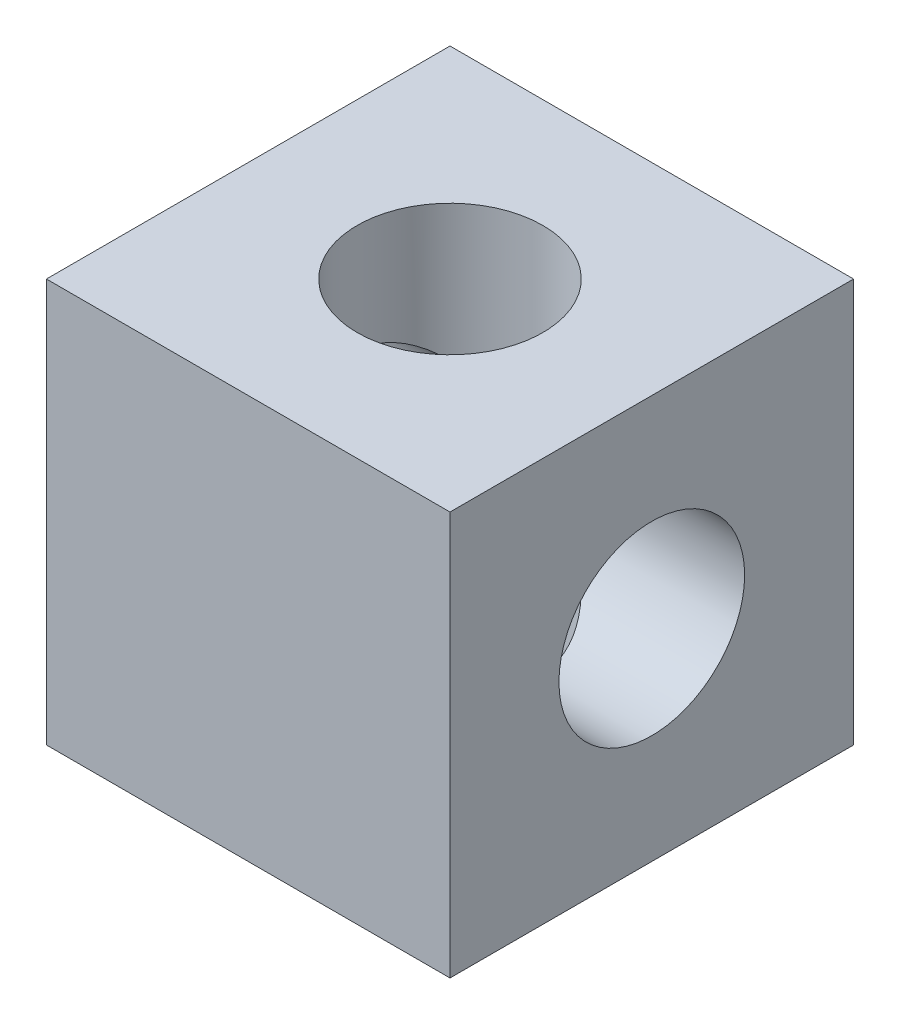
ISO-10303-21;
HEADER;
FILE_DESCRIPTION(('STEP AP214'),'2;1');
FILE_NAME('part.step','',(''),(''),'','','');
FILE_SCHEMA(('AUTOMOTIVE_DESIGN { 1 0 10303 214 1 1 1 1 }'));
ENDSEC;
DATA;
#1=APPLICATION_CONTEXT('core data for automotive mechanical design processes');
#2=APPLICATION_PROTOCOL_DEFINITION('international standard','automotive_design',2000,#1);
#3=PRODUCT_CONTEXT('',#1,'mechanical');
#4=PRODUCT('Part','Part','',(#3));
#5=PRODUCT_RELATED_PRODUCT_CATEGORY('part','',(#4));
#6=PRODUCT_DEFINITION_FORMATION('','',#4);
#7=PRODUCT_DEFINITION_CONTEXT('part definition',#1,'design');
#8=PRODUCT_DEFINITION('design','',#6,#7);
#9=PRODUCT_DEFINITION_SHAPE('','',#8);
#10=(LENGTH_UNIT() NAMED_UNIT(*) SI_UNIT(.MILLI.,.METRE.));
#11=(NAMED_UNIT(*) PLANE_ANGLE_UNIT() SI_UNIT($,.RADIAN.));
#12=(NAMED_UNIT(*) SI_UNIT($,.STERADIAN.) SOLID_ANGLE_UNIT());
#13=UNCERTAINTY_MEASURE_WITH_UNIT(LENGTH_MEASURE(1.E-05),#10,'distance_accuracy_value','');
#14=(GEOMETRIC_REPRESENTATION_CONTEXT(3) GLOBAL_UNCERTAINTY_ASSIGNED_CONTEXT((#13)) GLOBAL_UNIT_ASSIGNED_CONTEXT((#10,
#11,#12)) REPRESENTATION_CONTEXT('',''));
#15=CARTESIAN_POINT('',(0.,0.,0.));
#16=DIRECTION('',(0.,0.,1.));
#17=DIRECTION('',(1.,0.,0.));
#18=AXIS2_PLACEMENT_3D('',#15,#16,#17);
#19=CARTESIAN_POINT('',(-2.53896029471961,-13.5951862464183,10.16));
#20=DIRECTION('',(0.,1.,0.));
#21=DIRECTION('',(0.,0.,1.));
#22=AXIS2_PLACEMENT_3D('',#19,#20,#21);
#23=CYLINDRICAL_SURFACE('',#22,4.675);
#24=CARTESIAN_POINT('',(-2.53896029471961,6.72481375358166,10.16));
#25=DIRECTION('',(0.,1.,0.));
#26=DIRECTION('',(0.,0.,1.));
#27=AXIS2_PLACEMENT_3D('',#24,#25,#26);
#28=CIRCLE('',#27,4.675);
#29=CARTESIAN_POINT('',(-2.53896029471961,6.72481375358166,14.835));
#30=VERTEX_POINT('',#29);
#31=EDGE_CURVE('E153',#30,#30,#28,.T.);
#32=ORIENTED_EDGE('',*,*,#31,.T.);
#33=EDGE_LOOP('',(#32));
#34=FACE_BOUND('',#33,.T.);
#35=CARTESIAN_POINT('',(-2.53896029471961,-3.43518624641834,10.16));
#36=DIRECTION('',(0.707106781186547,0.707106781186547,0.));
#37=DIRECTION('',(-0.707106781186547,0.707106781186547,0.));
#38=AXIS2_PLACEMENT_3D('',#35,#36,#37);
#39=ELLIPSE('',#38,6.61144840409422,4.675);
#40=CARTESIAN_POINT('',(-2.53896029471961,-3.43518624641834,14.835));
#41=VERTEX_POINT('',#40);
#42=CARTESIAN_POINT('',(-2.53896029471961,-3.43518624641834,5.485));
#43=VERTEX_POINT('',#42);
#44=EDGE_CURVE('E59',#41,#43,#39,.F.);
#45=ORIENTED_EDGE('',*,*,#44,.T.);
#46=CARTESIAN_POINT('',(-2.53896029471961,-3.43518624641834,10.16));
#47=DIRECTION('',(-0.707106781186547,0.707106781186547,0.));
#48=DIRECTION('',(0.707106781186547,0.707106781186547,0.));
#49=AXIS2_PLACEMENT_3D('',#46,#47,#48);
#50=ELLIPSE('',#49,6.61144840409422,4.675);
#51=EDGE_CURVE('E11',#43,#41,#50,.F.);
#52=ORIENTED_EDGE('',*,*,#51,.T.);
#53=EDGE_LOOP('',(#45,#52));
#54=FACE_BOUND('',#53,.T.);
#55=ADVANCED_FACE('F45',(#34,#54),#23,.F.);
#56=CARTESIAN_POINT('',(-12.6989602947196,6.72481375358166,20.32));
#57=DIRECTION('',(1.,0.,0.));
#58=DIRECTION('',(0.,0.,-1.));
#59=AXIS2_PLACEMENT_3D('',#56,#57,#58);
#60=PLANE('',#59);
#61=CARTESIAN_POINT('',(-12.6989602947196,-3.43518624641834,10.16));
#62=DIRECTION('',(-1.,0.,0.));
#63=DIRECTION('',(0.,0.,1.));
#64=AXIS2_PLACEMENT_3D('',#61,#62,#63);
#65=CIRCLE('',#64,4.675);
#66=CARTESIAN_POINT('',(-12.6989602947196,-3.43518624641834,14.835));
#67=VERTEX_POINT('',#66);
#68=EDGE_CURVE('E161',#67,#67,#65,.T.);
#69=ORIENTED_EDGE('',*,*,#68,.F.);
#70=EDGE_LOOP('',(#69));
#71=FACE_BOUND('',#70,.T.);
#72=DIRECTION('',(0.,-1.,0.));
#73=VECTOR('',#72,1.);
#74=CARTESIAN_POINT('',(-12.6989602947196,6.72481375358166,0.));
#75=LINE('',#74,#73);
#76=CARTESIAN_POINT('',(-12.6989602947196,6.72481375358166,0.));
#77=VERTEX_POINT('',#76);
#78=CARTESIAN_POINT('',(-12.6989602947196,-13.5951862464183,0.));
#79=VERTEX_POINT('',#78);
#80=EDGE_CURVE('E139',#77,#79,#75,.T.);
#81=ORIENTED_EDGE('',*,*,#80,.T.);
#82=DIRECTION('',(0.,0.,-1.));
#83=VECTOR('',#82,1.);
#84=CARTESIAN_POINT('',(-12.6989602947196,-13.5951862464183,20.32));
#85=LINE('',#84,#83);
#86=CARTESIAN_POINT('',(-12.6989602947196,-13.5951862464183,20.32));
#87=VERTEX_POINT('',#86);
#88=EDGE_CURVE('E112',#87,#79,#85,.T.);
#89=ORIENTED_EDGE('',*,*,#88,.F.);
#90=DIRECTION('',(0.,-1.,0.));
#91=VECTOR('',#90,1.);
#92=CARTESIAN_POINT('',(-12.6989602947196,6.72481375358166,20.32));
#93=LINE('',#92,#91);
#94=CARTESIAN_POINT('',(-12.6989602947196,6.72481375358166,20.32));
#95=VERTEX_POINT('',#94);
#96=EDGE_CURVE('E132',#95,#87,#93,.T.);
#97=ORIENTED_EDGE('',*,*,#96,.F.);
#98=DIRECTION('',(0.,0.,-1.));
#99=VECTOR('',#98,1.);
#100=CARTESIAN_POINT('',(-12.6989602947196,6.72481375358166,20.32));
#101=LINE('',#100,#99);
#102=EDGE_CURVE('E127',#95,#77,#101,.T.);
#103=ORIENTED_EDGE('',*,*,#102,.T.);
#104=EDGE_LOOP('',(#81,#89,#97,#103));
#105=FACE_BOUND('',#104,.T.);
#106=ADVANCED_FACE('F47',(#71,#105),#60,.F.);
#107=CARTESIAN_POINT('',(-12.6989602947196,-13.5951862464183,20.32));
#108=DIRECTION('',(0.,1.,0.));
#109=DIRECTION('',(0.,0.,1.));
#110=AXIS2_PLACEMENT_3D('',#107,#108,#109);
#111=PLANE('',#110);
#112=CARTESIAN_POINT('',(-2.53896029471961,-13.5951862464183,10.16));
#113=DIRECTION('',(0.,1.,0.));
#114=DIRECTION('',(0.,0.,1.));
#115=AXIS2_PLACEMENT_3D('',#112,#113,#114);
#116=CIRCLE('',#115,4.675);
#117=CARTESIAN_POINT('',(-2.53896029471961,-13.5951862464183,14.835));
#118=VERTEX_POINT('',#117);
#119=EDGE_CURVE('E143',#118,#118,#116,.T.);
#120=ORIENTED_EDGE('',*,*,#119,.T.);
#121=EDGE_LOOP('',(#120));
#122=FACE_BOUND('',#121,.T.);
#123=DIRECTION('',(1.,0.,0.));
#124=VECTOR('',#123,1.);
#125=CARTESIAN_POINT('',(-12.6989602947196,-13.5951862464183,0.));
#126=LINE('',#125,#124);
#127=CARTESIAN_POINT('',(7.6210397052804,-13.5951862464183,0.));
#128=VERTEX_POINT('',#127);
#129=EDGE_CURVE('E136',#79,#128,#126,.T.);
#130=ORIENTED_EDGE('',*,*,#129,.T.);
#131=DIRECTION('',(0.,0.,-1.));
#132=VECTOR('',#131,1.);
#133=CARTESIAN_POINT('',(7.6210397052804,-13.5951862464183,20.32));
#134=LINE('',#133,#132);
#135=CARTESIAN_POINT('',(7.6210397052804,-13.5951862464183,20.32));
#136=VERTEX_POINT('',#135);
#137=EDGE_CURVE('E120',#136,#128,#134,.T.);
#138=ORIENTED_EDGE('',*,*,#137,.F.);
#139=DIRECTION('',(1.,0.,0.));
#140=VECTOR('',#139,1.);
#141=CARTESIAN_POINT('',(-12.6989602947196,-13.5951862464183,20.32));
#142=LINE('',#141,#140);
#143=EDGE_CURVE('E97',#87,#136,#142,.T.);
#144=ORIENTED_EDGE('',*,*,#143,.F.);
#145=ORIENTED_EDGE('',*,*,#88,.T.);
#146=EDGE_LOOP('',(#130,#138,#144,#145));
#147=FACE_BOUND('',#146,.T.);
#148=ADVANCED_FACE('F185',(#122,#147),#111,.F.);
#149=CARTESIAN_POINT('',(7.62103970528039,6.72481375358166,20.32));
#150=DIRECTION('',(-1.,0.,0.));
#151=DIRECTION('',(0.,-1.,0.));
#152=AXIS2_PLACEMENT_3D('',#149,#150,#151);
#153=PLANE('',#152);
#154=CARTESIAN_POINT('',(7.6210397052804,-3.43518624641834,10.16));
#155=DIRECTION('',(-1.,0.,0.));
#156=DIRECTION('',(0.,0.,1.));
#157=AXIS2_PLACEMENT_3D('',#154,#155,#156);
#158=CIRCLE('',#157,4.675);
#159=CARTESIAN_POINT('',(7.6210397052804,-3.43518624641834,14.835));
#160=VERTEX_POINT('',#159);
#161=EDGE_CURVE('E157',#160,#160,#158,.T.);
#162=ORIENTED_EDGE('',*,*,#161,.T.);
#163=EDGE_LOOP('',(#162));
#164=FACE_BOUND('',#163,.T.);
#165=DIRECTION('',(0.,1.,0.));
#166=VECTOR('',#165,1.);
#167=CARTESIAN_POINT('',(7.62103970528039,6.72481375358166,0.));
#168=LINE('',#167,#166);
#169=CARTESIAN_POINT('',(7.62103970528039,6.72481375358166,0.));
#170=VERTEX_POINT('',#169);
#171=EDGE_CURVE('E133',#128,#170,#168,.T.);
#172=ORIENTED_EDGE('',*,*,#171,.T.);
#173=DIRECTION('',(0.,0.,-1.));
#174=VECTOR('',#173,1.);
#175=CARTESIAN_POINT('',(7.62103970528039,6.72481375358166,20.32));
#176=LINE('',#175,#174);
#177=CARTESIAN_POINT('',(7.62103970528039,6.72481375358166,20.32));
#178=VERTEX_POINT('',#177);
#179=EDGE_CURVE('E124',#178,#170,#176,.T.);
#180=ORIENTED_EDGE('',*,*,#179,.F.);
#181=DIRECTION('',(0.,1.,0.));
#182=VECTOR('',#181,1.);
#183=CARTESIAN_POINT('',(7.62103970528039,6.72481375358166,20.32));
#184=LINE('',#183,#182);
#185=EDGE_CURVE('E146',#136,#178,#184,.T.);
#186=ORIENTED_EDGE('',*,*,#185,.F.);
#187=ORIENTED_EDGE('',*,*,#137,.T.);
#188=EDGE_LOOP('',(#172,#180,#186,#187));
#189=FACE_BOUND('',#188,.T.);
#190=ADVANCED_FACE('F169',(#164,#189),#153,.F.);
#191=CARTESIAN_POINT('',(-12.6989602947196,6.72481375358166,20.32));
#192=DIRECTION('',(0.,-1.,0.));
#193=DIRECTION('',(0.,0.,-1.));
#194=AXIS2_PLACEMENT_3D('',#191,#192,#193);
#195=PLANE('',#194);
#196=ORIENTED_EDGE('',*,*,#31,.F.);
#197=EDGE_LOOP('',(#196));
#198=FACE_BOUND('',#197,.T.);
#199=DIRECTION('',(-1.,0.,0.));
#200=VECTOR('',#199,1.);
#201=CARTESIAN_POINT('',(-12.6989602947196,6.72481375358166,0.));
#202=LINE('',#201,#200);
#203=EDGE_CURVE('E89',#170,#77,#202,.T.);
#204=ORIENTED_EDGE('',*,*,#203,.T.);
#205=ORIENTED_EDGE('',*,*,#102,.F.);
#206=DIRECTION('',(-1.,0.,0.));
#207=VECTOR('',#206,1.);
#208=CARTESIAN_POINT('',(-12.6989602947196,6.72481375358166,20.32));
#209=LINE('',#208,#207);
#210=EDGE_CURVE('E68',#178,#95,#209,.T.);
#211=ORIENTED_EDGE('',*,*,#210,.F.);
#212=ORIENTED_EDGE('',*,*,#179,.T.);
#213=EDGE_LOOP('',(#204,#205,#211,#212));
#214=FACE_BOUND('',#213,.T.);
#215=ADVANCED_FACE('F201',(#198,#214),#195,.F.);
#216=CARTESIAN_POINT('',(0.,0.,20.32));
#217=DIRECTION('',(0.,0.,1.));
#218=DIRECTION('',(1.,0.,0.));
#219=AXIS2_PLACEMENT_3D('',#216,#217,#218);
#220=PLANE('',#219);
#221=ORIENTED_EDGE('',*,*,#96,.T.);
#222=ORIENTED_EDGE('',*,*,#143,.T.);
#223=ORIENTED_EDGE('',*,*,#185,.T.);
#224=ORIENTED_EDGE('',*,*,#210,.T.);
#225=EDGE_LOOP('',(#221,#222,#223,#224));
#226=FACE_BOUND('',#225,.T.);
#227=ADVANCED_FACE('F194',(#226),#220,.T.);
#228=CARTESIAN_POINT('',(0.,0.,0.));
#229=DIRECTION('',(0.,0.,1.));
#230=DIRECTION('',(1.,0.,0.));
#231=AXIS2_PLACEMENT_3D('',#228,#229,#230);
#232=PLANE('',#231);
#233=ORIENTED_EDGE('',*,*,#80,.F.);
#234=ORIENTED_EDGE('',*,*,#203,.F.);
#235=ORIENTED_EDGE('',*,*,#171,.F.);
#236=ORIENTED_EDGE('',*,*,#129,.F.);
#237=EDGE_LOOP('',(#233,#234,#235,#236));
#238=FACE_BOUND('',#237,.T.);
#239=ADVANCED_FACE('F189',(#238),#232,.F.);
#240=CARTESIAN_POINT('',(-2.53896029471961,-3.43518624641834,10.16));
#241=DIRECTION('',(0.707106781186547,0.707106781186547,0.));
#242=DIRECTION('',(-0.707106781186547,0.707106781186547,0.));
#243=AXIS2_PLACEMENT_3D('',#240,#241,#242);
#244=ELLIPSE('',#243,6.61144840409422,4.675);
#245=EDGE_CURVE('E103',#41,#43,#244,.T.);
#246=ORIENTED_EDGE('',*,*,#245,.T.);
#247=CARTESIAN_POINT('',(-2.53896029471961,-3.43518624641834,10.16));
#248=DIRECTION('',(-0.707106781186547,0.707106781186547,0.));
#249=DIRECTION('',(0.707106781186547,0.707106781186547,0.));
#250=AXIS2_PLACEMENT_3D('',#247,#248,#249);
#251=ELLIPSE('',#250,6.61144840409422,4.675);
#252=EDGE_CURVE('E54',#43,#41,#251,.T.);
#253=ORIENTED_EDGE('',*,*,#252,.T.);
#254=EDGE_LOOP('',(#246,#253));
#255=FACE_BOUND('',#254,.T.);
#256=ORIENTED_EDGE('',*,*,#119,.F.);
#257=EDGE_LOOP('',(#256));
#258=FACE_BOUND('',#257,.T.);
#259=ADVANCED_FACE('F114',(#255,#258),#23,.F.);
#260=CARTESIAN_POINT('',(7.6210397052804,-3.43518624641834,10.16));
#261=DIRECTION('',(-1.,0.,0.));
#262=DIRECTION('',(0.,0.,1.));
#263=AXIS2_PLACEMENT_3D('',#260,#261,#262);
#264=CYLINDRICAL_SURFACE('',#263,4.675);
#265=ORIENTED_EDGE('',*,*,#68,.T.);
#266=EDGE_LOOP('',(#265));
#267=FACE_BOUND('',#266,.T.);
#268=ORIENTED_EDGE('',*,*,#44,.F.);
#269=ORIENTED_EDGE('',*,*,#252,.F.);
#270=EDGE_LOOP('',(#268,#269));
#271=FACE_BOUND('',#270,.T.);
#272=ADVANCED_FACE('F110',(#267,#271),#264,.F.);
#273=ORIENTED_EDGE('',*,*,#161,.F.);
#274=EDGE_LOOP('',(#273));
#275=FACE_BOUND('',#274,.T.);
#276=ORIENTED_EDGE('',*,*,#245,.F.);
#277=ORIENTED_EDGE('',*,*,#51,.F.);
#278=EDGE_LOOP('',(#276,#277));
#279=FACE_BOUND('',#278,.T.);
#280=ADVANCED_FACE('F104',(#275,#279),#264,.F.);
#281=CLOSED_SHELL('',(#55,#106,#148,#190,#215,#227,#239,#259,#272,#280));
#282=MANIFOLD_SOLID_BREP('B2',#281);
#283=ADVANCED_BREP_SHAPE_REPRESENTATION('',(#18,#282),#14);
#284=SHAPE_DEFINITION_REPRESENTATION(#9,#283);
ENDSEC;
END-ISO-10303-21;
